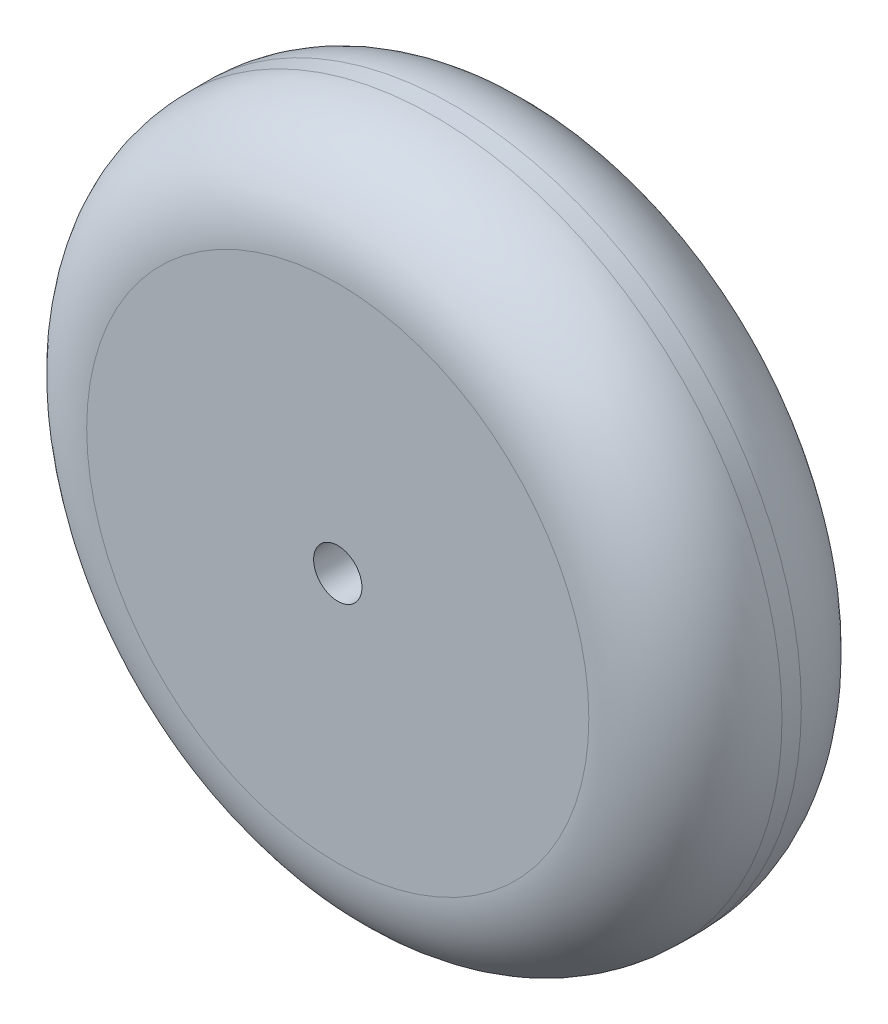
ISO-10303-21;
HEADER;
FILE_DESCRIPTION(('STEP AP214'),'2;1');
FILE_NAME('part.step','',(''),(''),'','','');
FILE_SCHEMA(('AUTOMOTIVE_DESIGN { 1 0 10303 214 1 1 1 1 }'));
ENDSEC;
DATA;
#1=APPLICATION_CONTEXT('core data for automotive mechanical design processes');
#2=APPLICATION_PROTOCOL_DEFINITION('international standard','automotive_design',2000,#1);
#3=PRODUCT_CONTEXT('',#1,'mechanical');
#4=PRODUCT('Part','Part','',(#3));
#5=PRODUCT_RELATED_PRODUCT_CATEGORY('part','',(#4));
#6=PRODUCT_DEFINITION_FORMATION('','',#4);
#7=PRODUCT_DEFINITION_CONTEXT('part definition',#1,'design');
#8=PRODUCT_DEFINITION('design','',#6,#7);
#9=PRODUCT_DEFINITION_SHAPE('','',#8);
#10=(LENGTH_UNIT() NAMED_UNIT(*) SI_UNIT(.MILLI.,.METRE.));
#11=(NAMED_UNIT(*) PLANE_ANGLE_UNIT() SI_UNIT($,.RADIAN.));
#12=(NAMED_UNIT(*) SI_UNIT($,.STERADIAN.) SOLID_ANGLE_UNIT());
#13=UNCERTAINTY_MEASURE_WITH_UNIT(LENGTH_MEASURE(1.E-05),#10,'distance_accuracy_value','');
#14=(GEOMETRIC_REPRESENTATION_CONTEXT(3) GLOBAL_UNCERTAINTY_ASSIGNED_CONTEXT((#13)) GLOBAL_UNIT_ASSIGNED_CONTEXT((#10,
#11,#12)) REPRESENTATION_CONTEXT('',''));
#15=CARTESIAN_POINT('',(0.,0.,0.));
#16=DIRECTION('',(0.,0.,1.));
#17=DIRECTION('',(1.,0.,0.));
#18=AXIS2_PLACEMENT_3D('',#15,#16,#17);
#19=CARTESIAN_POINT('',(0.,0.,22.));
#20=DIRECTION('',(0.,0.,-1.));
#21=DIRECTION('',(-1.,0.,0.));
#22=AXIS2_PLACEMENT_3D('',#19,#20,#21);
#23=CYLINDRICAL_SURFACE('',#22,36.);
#24=CARTESIAN_POINT('',(0.,0.,10.));
#25=DIRECTION('',(0.,0.,1.));
#26=DIRECTION('',(1.,0.,0.));
#27=AXIS2_PLACEMENT_3D('',#24,#25,#26);
#28=CIRCLE('',#27,36.);
#29=CARTESIAN_POINT('',(36.,0.,10.));
#30=VERTEX_POINT('',#29);
#31=EDGE_CURVE('E41',#30,#30,#28,.T.);
#32=ORIENTED_EDGE('',*,*,#31,.T.);
#33=EDGE_LOOP('',(#32));
#34=FACE_BOUND('',#33,.T.);
#35=CARTESIAN_POINT('',(0.,0.,12.));
#36=DIRECTION('',(0.,0.,1.));
#37=DIRECTION('',(1.,0.,0.));
#38=AXIS2_PLACEMENT_3D('',#35,#36,#37);
#39=CIRCLE('',#38,36.);
#40=CARTESIAN_POINT('',(36.,0.,12.));
#41=VERTEX_POINT('',#40);
#42=EDGE_CURVE('E45',#41,#41,#39,.F.);
#43=ORIENTED_EDGE('',*,*,#42,.T.);
#44=EDGE_LOOP('',(#43));
#45=FACE_BOUND('',#44,.T.);
#46=ADVANCED_FACE('F30',(#34,#45),#23,.T.);
#47=CARTESIAN_POINT('',(0.,0.,22.));
#48=DIRECTION('',(0.,0.,1.));
#49=DIRECTION('',(1.,0.,0.));
#50=AXIS2_PLACEMENT_3D('',#47,#48,#49);
#51=PLANE('',#50);
#52=CARTESIAN_POINT('',(0.,0.,22.));
#53=DIRECTION('',(0.,0.,1.));
#54=DIRECTION('',(1.,0.,0.));
#55=AXIS2_PLACEMENT_3D('',#52,#53,#54);
#56=CIRCLE('',#55,26.);
#57=CARTESIAN_POINT('',(26.,0.,22.));
#58=VERTEX_POINT('',#57);
#59=EDGE_CURVE('E10',#58,#58,#56,.T.);
#60=ORIENTED_EDGE('',*,*,#59,.T.);
#61=EDGE_LOOP('',(#60));
#62=FACE_BOUND('',#61,.T.);
#63=CARTESIAN_POINT('',(0.,0.,22.));
#64=DIRECTION('',(0.,0.,1.));
#65=DIRECTION('',(1.,0.,0.));
#66=AXIS2_PLACEMENT_3D('',#63,#64,#65);
#67=CIRCLE('',#66,2.5);
#68=CARTESIAN_POINT('',(2.5,0.,22.));
#69=VERTEX_POINT('',#68);
#70=EDGE_CURVE('E51',#69,#69,#67,.T.);
#71=ORIENTED_EDGE('',*,*,#70,.F.);
#72=EDGE_LOOP('',(#71));
#73=FACE_BOUND('',#72,.T.);
#74=ADVANCED_FACE('F66',(#62,#73),#51,.T.);
#75=CARTESIAN_POINT('',(0.,0.,0.));
#76=DIRECTION('',(0.,0.,1.));
#77=DIRECTION('',(1.,0.,0.));
#78=AXIS2_PLACEMENT_3D('',#75,#76,#77);
#79=PLANE('',#78);
#80=CARTESIAN_POINT('',(0.,0.,0.));
#81=DIRECTION('',(0.,0.,1.));
#82=DIRECTION('',(1.,0.,0.));
#83=AXIS2_PLACEMENT_3D('',#80,#81,#82);
#84=CIRCLE('',#83,26.);
#85=CARTESIAN_POINT('',(26.,0.,0.));
#86=VERTEX_POINT('',#85);
#87=EDGE_CURVE('E37',#86,#86,#84,.F.);
#88=ORIENTED_EDGE('',*,*,#87,.T.);
#89=EDGE_LOOP('',(#88));
#90=FACE_BOUND('',#89,.T.);
#91=CARTESIAN_POINT('',(0.,0.,0.));
#92=DIRECTION('',(0.,0.,1.));
#93=DIRECTION('',(1.,0.,0.));
#94=AXIS2_PLACEMENT_3D('',#91,#92,#93);
#95=CIRCLE('',#94,2.5);
#96=CARTESIAN_POINT('',(2.5,0.,0.));
#97=VERTEX_POINT('',#96);
#98=EDGE_CURVE('E50',#97,#97,#95,.T.);
#99=ORIENTED_EDGE('',*,*,#98,.T.);
#100=EDGE_LOOP('',(#99));
#101=FACE_BOUND('',#100,.T.);
#102=ADVANCED_FACE('F57',(#90,#101),#79,.F.);
#103=CARTESIAN_POINT('',(0.,0.,0.));
#104=DIRECTION('',(0.,0.,1.));
#105=DIRECTION('',(1.,0.,0.));
#106=AXIS2_PLACEMENT_3D('',#103,#104,#105);
#107=CYLINDRICAL_SURFACE('',#106,2.5);
#108=ORIENTED_EDGE('',*,*,#98,.F.);
#109=EDGE_LOOP('',(#108));
#110=FACE_BOUND('',#109,.T.);
#111=ORIENTED_EDGE('',*,*,#70,.T.);
#112=EDGE_LOOP('',(#111));
#113=FACE_BOUND('',#112,.T.);
#114=ADVANCED_FACE('F59',(#110,#113),#107,.F.);
#115=CARTESIAN_POINT('',(0.,0.,10.));
#116=DIRECTION('',(0.,0.,1.));
#117=DIRECTION('',(1.,0.,0.));
#118=AXIS2_PLACEMENT_3D('',#115,#116,#117);
#119=TOROIDAL_SURFACE('',#118,26.,10.);
#120=ORIENTED_EDGE('',*,*,#87,.F.);
#121=EDGE_LOOP('',(#120));
#122=FACE_BOUND('',#121,.T.);
#123=ORIENTED_EDGE('',*,*,#31,.F.);
#124=EDGE_LOOP('',(#123));
#125=FACE_BOUND('',#124,.T.);
#126=ADVANCED_FACE('F62',(#122,#125),#119,.T.);
#127=CARTESIAN_POINT('',(0.,0.,12.));
#128=DIRECTION('',(0.,0.,1.));
#129=DIRECTION('',(1.,0.,0.));
#130=AXIS2_PLACEMENT_3D('',#127,#128,#129);
#131=TOROIDAL_SURFACE('',#130,26.,10.);
#132=ORIENTED_EDGE('',*,*,#42,.F.);
#133=EDGE_LOOP('',(#132));
#134=FACE_BOUND('',#133,.T.);
#135=ORIENTED_EDGE('',*,*,#59,.F.);
#136=EDGE_LOOP('',(#135));
#137=FACE_BOUND('',#136,.T.);
#138=ADVANCED_FACE('F32',(#134,#137),#131,.T.);
#139=CLOSED_SHELL('',(#46,#74,#102,#114,#126,#138));
#140=MANIFOLD_SOLID_BREP('B2',#139);
#141=ADVANCED_BREP_SHAPE_REPRESENTATION('',(#18,#140),#14);
#142=SHAPE_DEFINITION_REPRESENTATION(#9,#141);
ENDSEC;
END-ISO-10303-21;
